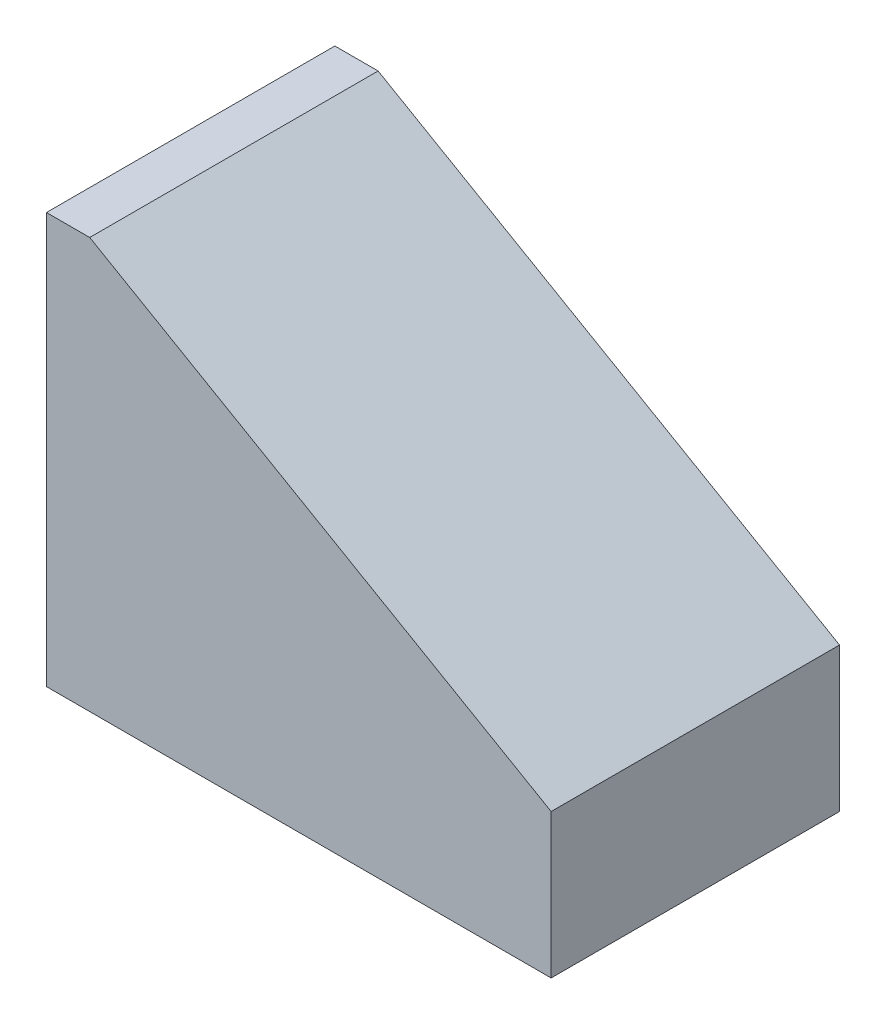
ISO-10303-21;
HEADER;
FILE_DESCRIPTION(('STEP AP214'),'2;1');
FILE_NAME('part.step','',(''),(''),'','','');
FILE_SCHEMA(('AUTOMOTIVE_DESIGN { 1 0 10303 214 1 1 1 1 }'));
ENDSEC;
DATA;
#1=APPLICATION_CONTEXT('core data for automotive mechanical design processes');
#2=APPLICATION_PROTOCOL_DEFINITION('international standard','automotive_design',2000,#1);
#3=PRODUCT_CONTEXT('',#1,'mechanical');
#4=PRODUCT('Part','Part','',(#3));
#5=PRODUCT_RELATED_PRODUCT_CATEGORY('part','',(#4));
#6=PRODUCT_DEFINITION_FORMATION('','',#4);
#7=PRODUCT_DEFINITION_CONTEXT('part definition',#1,'design');
#8=PRODUCT_DEFINITION('design','',#6,#7);
#9=PRODUCT_DEFINITION_SHAPE('','',#8);
#10=(LENGTH_UNIT() NAMED_UNIT(*) SI_UNIT(.MILLI.,.METRE.));
#11=(NAMED_UNIT(*) PLANE_ANGLE_UNIT() SI_UNIT($,.RADIAN.));
#12=(NAMED_UNIT(*) SI_UNIT($,.STERADIAN.) SOLID_ANGLE_UNIT());
#13=UNCERTAINTY_MEASURE_WITH_UNIT(LENGTH_MEASURE(1.E-05),#10,'distance_accuracy_value','');
#14=(GEOMETRIC_REPRESENTATION_CONTEXT(3) GLOBAL_UNCERTAINTY_ASSIGNED_CONTEXT((#13)) GLOBAL_UNIT_ASSIGNED_CONTEXT((#10,
#11,#12)) REPRESENTATION_CONTEXT('',''));
#15=CARTESIAN_POINT('',(0.,0.,0.));
#16=DIRECTION('',(0.,0.,1.));
#17=DIRECTION('',(1.,0.,0.));
#18=AXIS2_PLACEMENT_3D('',#15,#16,#17);
#19=CARTESIAN_POINT('',(0.,100.,100.));
#20=DIRECTION('',(-1.,0.,0.));
#21=DIRECTION('',(0.,-1.,0.));
#22=AXIS2_PLACEMENT_3D('',#19,#20,#21);
#23=PLANE('',#22);
#24=DIRECTION('',(0.,1.,0.));
#25=VECTOR('',#24,1.);
#26=CARTESIAN_POINT('',(0.,100.,-100.));
#27=LINE('',#26,#25);
#28=CARTESIAN_POINT('',(0.,0.,-100.));
#29=VERTEX_POINT('',#28);
#30=CARTESIAN_POINT('',(0.,100.,-100.));
#31=VERTEX_POINT('',#30);
#32=EDGE_CURVE('E118',#29,#31,#27,.T.);
#33=ORIENTED_EDGE('',*,*,#32,.T.);
#34=DIRECTION('',(0.,0.,-1.));
#35=VECTOR('',#34,1.);
#36=CARTESIAN_POINT('',(0.,100.,100.));
#37=LINE('',#36,#35);
#38=CARTESIAN_POINT('',(0.,100.,100.));
#39=VERTEX_POINT('',#38);
#40=EDGE_CURVE('E11',#39,#31,#37,.T.);
#41=ORIENTED_EDGE('',*,*,#40,.F.);
#42=DIRECTION('',(0.,1.,0.));
#43=VECTOR('',#42,1.);
#44=CARTESIAN_POINT('',(0.,100.,100.));
#45=LINE('',#44,#43);
#46=CARTESIAN_POINT('',(0.,0.,100.));
#47=VERTEX_POINT('',#46);
#48=EDGE_CURVE('E131',#47,#39,#45,.T.);
#49=ORIENTED_EDGE('',*,*,#48,.F.);
#50=DIRECTION('',(0.,0.,-1.));
#51=VECTOR('',#50,1.);
#52=CARTESIAN_POINT('',(0.,0.,100.));
#53=LINE('',#52,#51);
#54=EDGE_CURVE('E114',#47,#29,#53,.T.);
#55=ORIENTED_EDGE('',*,*,#54,.T.);
#56=EDGE_LOOP('',(#33,#41,#49,#55));
#57=FACE_BOUND('',#56,.T.);
#58=ADVANCED_FACE('F39',(#57),#23,.F.);
#59=CARTESIAN_POINT('',(-320.,284.752086140678,100.));
#60=DIRECTION('',(-0.499999999999995,-0.866025403784442,0.));
#61=DIRECTION('',(0.866025403784442,-0.499999999999995,0.));
#62=AXIS2_PLACEMENT_3D('',#59,#60,#61);
#63=PLANE('',#62);
#64=DIRECTION('',(-0.866025403784442,0.499999999999995,0.));
#65=VECTOR('',#64,1.);
#66=CARTESIAN_POINT('',(-320.,284.752086140678,-100.));
#67=LINE('',#66,#65);
#68=CARTESIAN_POINT('',(-320.,284.752086140678,-100.));
#69=VERTEX_POINT('',#68);
#70=EDGE_CURVE('E122',#31,#69,#67,.T.);
#71=ORIENTED_EDGE('',*,*,#70,.T.);
#72=DIRECTION('',(0.,0.,-1.));
#73=VECTOR('',#72,1.);
#74=CARTESIAN_POINT('',(-320.,284.752086140678,100.));
#75=LINE('',#74,#73);
#76=CARTESIAN_POINT('',(-320.,284.752086140678,100.));
#77=VERTEX_POINT('',#76);
#78=EDGE_CURVE('E48',#77,#69,#75,.T.);
#79=ORIENTED_EDGE('',*,*,#78,.F.);
#80=DIRECTION('',(-0.866025403784442,0.499999999999995,0.));
#81=VECTOR('',#80,1.);
#82=CARTESIAN_POINT('',(-320.,284.752086140678,100.));
#83=LINE('',#82,#81);
#84=EDGE_CURVE('E90',#39,#77,#83,.T.);
#85=ORIENTED_EDGE('',*,*,#84,.F.);
#86=ORIENTED_EDGE('',*,*,#40,.T.);
#87=EDGE_LOOP('',(#71,#79,#85,#86));
#88=FACE_BOUND('',#87,.T.);
#89=ADVANCED_FACE('F153',(#88),#63,.F.);
#90=CARTESIAN_POINT('',(-350.,284.752086140678,100.));
#91=DIRECTION('',(0.,-1.,0.));
#92=DIRECTION('',(0.,0.,-1.));
#93=AXIS2_PLACEMENT_3D('',#90,#91,#92);
#94=PLANE('',#93);
#95=DIRECTION('',(-1.,0.,0.));
#96=VECTOR('',#95,1.);
#97=CARTESIAN_POINT('',(-350.,284.752086140678,-100.));
#98=LINE('',#97,#96);
#99=CARTESIAN_POINT('',(-350.,284.752086140678,-100.));
#100=VERTEX_POINT('',#99);
#101=EDGE_CURVE('E106',#69,#100,#98,.T.);
#102=ORIENTED_EDGE('',*,*,#101,.T.);
#103=DIRECTION('',(0.,0.,-1.));
#104=VECTOR('',#103,1.);
#105=CARTESIAN_POINT('',(-350.,284.752086140678,100.));
#106=LINE('',#105,#104);
#107=CARTESIAN_POINT('',(-350.,284.752086140678,100.));
#108=VERTEX_POINT('',#107);
#109=EDGE_CURVE('E103',#108,#100,#106,.T.);
#110=ORIENTED_EDGE('',*,*,#109,.F.);
#111=DIRECTION('',(-1.,0.,0.));
#112=VECTOR('',#111,1.);
#113=CARTESIAN_POINT('',(-350.,284.752086140678,100.));
#114=LINE('',#113,#112);
#115=EDGE_CURVE('E94',#77,#108,#114,.T.);
#116=ORIENTED_EDGE('',*,*,#115,.F.);
#117=ORIENTED_EDGE('',*,*,#78,.T.);
#118=EDGE_LOOP('',(#102,#110,#116,#117));
#119=FACE_BOUND('',#118,.T.);
#120=ADVANCED_FACE('F104',(#119),#94,.F.);
#121=CARTESIAN_POINT('',(-350.,0.,100.));
#122=DIRECTION('',(1.,0.,0.));
#123=DIRECTION('',(0.,0.,-1.));
#124=AXIS2_PLACEMENT_3D('',#121,#122,#123);
#125=PLANE('',#124);
#126=DIRECTION('',(0.,-1.,0.));
#127=VECTOR('',#126,1.);
#128=CARTESIAN_POINT('',(-350.,0.,-100.));
#129=LINE('',#128,#127);
#130=CARTESIAN_POINT('',(-350.,0.,-100.));
#131=VERTEX_POINT('',#130);
#132=EDGE_CURVE('E76',#100,#131,#129,.T.);
#133=ORIENTED_EDGE('',*,*,#132,.T.);
#134=DIRECTION('',(0.,0.,-1.));
#135=VECTOR('',#134,1.);
#136=CARTESIAN_POINT('',(-350.,0.,100.));
#137=LINE('',#136,#135);
#138=CARTESIAN_POINT('',(-350.,0.,100.));
#139=VERTEX_POINT('',#138);
#140=EDGE_CURVE('E108',#139,#131,#137,.T.);
#141=ORIENTED_EDGE('',*,*,#140,.F.);
#142=DIRECTION('',(0.,-1.,0.));
#143=VECTOR('',#142,1.);
#144=CARTESIAN_POINT('',(-350.,0.,100.));
#145=LINE('',#144,#143);
#146=EDGE_CURVE('E98',#108,#139,#145,.T.);
#147=ORIENTED_EDGE('',*,*,#146,.F.);
#148=ORIENTED_EDGE('',*,*,#109,.T.);
#149=EDGE_LOOP('',(#133,#141,#147,#148));
#150=FACE_BOUND('',#149,.T.);
#151=ADVANCED_FACE('F110',(#150),#125,.F.);
#152=CARTESIAN_POINT('',(0.,0.,100.));
#153=DIRECTION('',(0.,1.,0.));
#154=DIRECTION('',(-1.,0.,0.));
#155=AXIS2_PLACEMENT_3D('',#152,#153,#154);
#156=PLANE('',#155);
#157=DIRECTION('',(1.,0.,0.));
#158=VECTOR('',#157,1.);
#159=CARTESIAN_POINT('',(0.,0.,-100.));
#160=LINE('',#159,#158);
#161=EDGE_CURVE('E82',#131,#29,#160,.T.);
#162=ORIENTED_EDGE('',*,*,#161,.T.);
#163=ORIENTED_EDGE('',*,*,#54,.F.);
#164=DIRECTION('',(1.,0.,0.));
#165=VECTOR('',#164,1.);
#166=CARTESIAN_POINT('',(0.,0.,100.));
#167=LINE('',#166,#165);
#168=EDGE_CURVE('E56',#139,#47,#167,.T.);
#169=ORIENTED_EDGE('',*,*,#168,.F.);
#170=ORIENTED_EDGE('',*,*,#140,.T.);
#171=EDGE_LOOP('',(#162,#163,#169,#170));
#172=FACE_BOUND('',#171,.T.);
#173=ADVANCED_FACE('F142',(#172),#156,.F.);
#174=CARTESIAN_POINT('',(0.,0.,100.));
#175=DIRECTION('',(0.,0.,-1.));
#176=DIRECTION('',(-1.,0.,0.));
#177=AXIS2_PLACEMENT_3D('',#174,#175,#176);
#178=PLANE('',#177);
#179=ORIENTED_EDGE('',*,*,#48,.T.);
#180=ORIENTED_EDGE('',*,*,#84,.T.);
#181=ORIENTED_EDGE('',*,*,#115,.T.);
#182=ORIENTED_EDGE('',*,*,#146,.T.);
#183=ORIENTED_EDGE('',*,*,#168,.T.);
#184=EDGE_LOOP('',(#179,#180,#181,#182,#183));
#185=FACE_BOUND('',#184,.T.);
#186=ADVANCED_FACE('F96',(#185),#178,.F.);
#187=CARTESIAN_POINT('',(0.,0.,-100.));
#188=DIRECTION('',(0.,0.,-1.));
#189=DIRECTION('',(-1.,0.,0.));
#190=AXIS2_PLACEMENT_3D('',#187,#188,#189);
#191=PLANE('',#190);
#192=ORIENTED_EDGE('',*,*,#32,.F.);
#193=ORIENTED_EDGE('',*,*,#161,.F.);
#194=ORIENTED_EDGE('',*,*,#132,.F.);
#195=ORIENTED_EDGE('',*,*,#101,.F.);
#196=ORIENTED_EDGE('',*,*,#70,.F.);
#197=EDGE_LOOP('',(#192,#193,#194,#195,#196));
#198=FACE_BOUND('',#197,.T.);
#199=ADVANCED_FACE('F138',(#198),#191,.T.);
#200=CLOSED_SHELL('',(#58,#89,#120,#151,#173,#186,#199));
#201=MANIFOLD_SOLID_BREP('B2',#200);
#202=ADVANCED_BREP_SHAPE_REPRESENTATION('',(#18,#201),#14);
#203=SHAPE_DEFINITION_REPRESENTATION(#9,#202);
ENDSEC;
END-ISO-10303-21;
